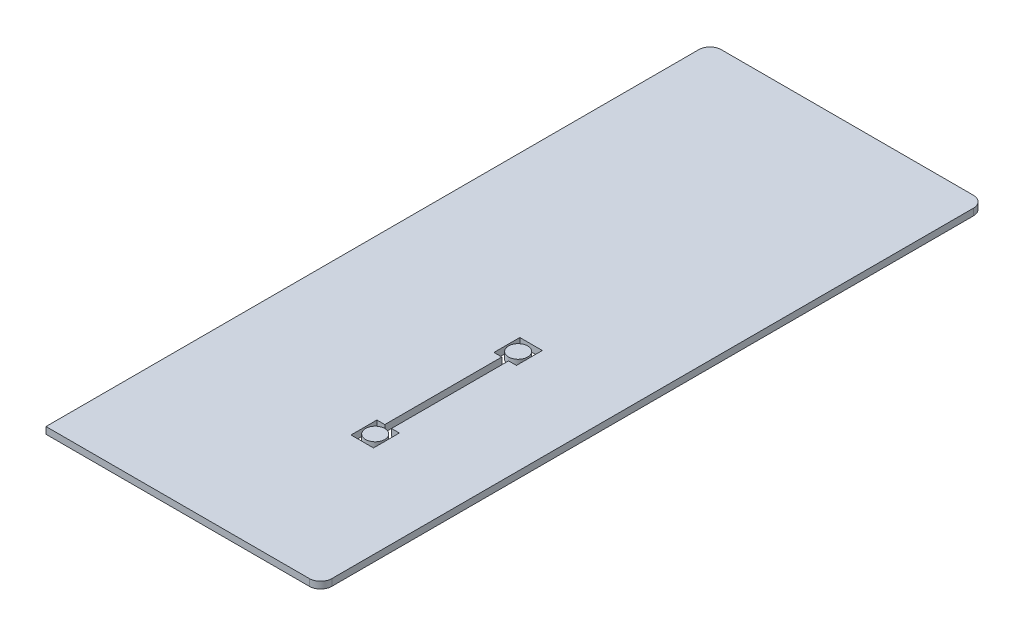
ISO-10303-21;
HEADER;
FILE_DESCRIPTION(('STEP AP214'),'2;1');
FILE_NAME('part.step','',(''),(''),'','','');
FILE_SCHEMA(('AUTOMOTIVE_DESIGN { 1 0 10303 214 1 1 1 1 }'));
ENDSEC;
DATA;
#1=APPLICATION_CONTEXT('core data for automotive mechanical design processes');
#2=APPLICATION_PROTOCOL_DEFINITION('international standard','automotive_design',2000,#1);
#3=PRODUCT_CONTEXT('',#1,'mechanical');
#4=PRODUCT('Part','Part','',(#3));
#5=PRODUCT_RELATED_PRODUCT_CATEGORY('part','',(#4));
#6=PRODUCT_DEFINITION_FORMATION('','',#4);
#7=PRODUCT_DEFINITION_CONTEXT('part definition',#1,'design');
#8=PRODUCT_DEFINITION('design','',#6,#7);
#9=PRODUCT_DEFINITION_SHAPE('','',#8);
#10=(LENGTH_UNIT() NAMED_UNIT(*) SI_UNIT(.MILLI.,.METRE.));
#11=(NAMED_UNIT(*) PLANE_ANGLE_UNIT() SI_UNIT($,.RADIAN.));
#12=(NAMED_UNIT(*) SI_UNIT($,.STERADIAN.) SOLID_ANGLE_UNIT());
#13=UNCERTAINTY_MEASURE_WITH_UNIT(LENGTH_MEASURE(1.E-05),#10,'distance_accuracy_value','');
#14=(GEOMETRIC_REPRESENTATION_CONTEXT(3) GLOBAL_UNCERTAINTY_ASSIGNED_CONTEXT((#13)) GLOBAL_UNIT_ASSIGNED_CONTEXT((#10,
#11,#12)) REPRESENTATION_CONTEXT('',''));
#15=CARTESIAN_POINT('',(0.,0.,0.));
#16=DIRECTION('',(0.,0.,1.));
#17=DIRECTION('',(1.,0.,0.));
#18=AXIS2_PLACEMENT_3D('',#15,#16,#17);
#19=CARTESIAN_POINT('',(0.,3.,0.));
#20=DIRECTION('',(1.,0.,0.));
#21=DIRECTION('',(0.,0.,-1.));
#22=AXIS2_PLACEMENT_3D('',#19,#20,#21);
#23=PLANE('',#22);
#24=DIRECTION('',(0.,0.,1.));
#25=VECTOR('',#24,1.);
#26=CARTESIAN_POINT('',(0.,3.,0.));
#27=LINE('',#26,#25);
#28=CARTESIAN_POINT('',(0.,3.,-290.));
#29=VERTEX_POINT('',#28);
#30=CARTESIAN_POINT('',(0.,3.,0.));
#31=VERTEX_POINT('',#30);
#32=EDGE_CURVE('E275',#29,#31,#27,.T.);
#33=ORIENTED_EDGE('',*,*,#32,.F.);
#34=DIRECTION('',(0.,-1.,0.));
#35=VECTOR('',#34,1.);
#36=CARTESIAN_POINT('',(0.,3.,-290.));
#37=LINE('',#36,#35);
#38=CARTESIAN_POINT('',(0.,0.,-290.));
#39=VERTEX_POINT('',#38);
#40=EDGE_CURVE('E244',#29,#39,#37,.T.);
#41=ORIENTED_EDGE('',*,*,#40,.T.);
#42=DIRECTION('',(0.,0.,1.));
#43=VECTOR('',#42,1.);
#44=CARTESIAN_POINT('',(0.,0.,0.));
#45=LINE('',#44,#43);
#46=CARTESIAN_POINT('',(0.,0.,0.));
#47=VERTEX_POINT('',#46);
#48=EDGE_CURVE('E248',#39,#47,#45,.T.);
#49=ORIENTED_EDGE('',*,*,#48,.T.);
#50=DIRECTION('',(0.,-1.,0.));
#51=VECTOR('',#50,1.);
#52=CARTESIAN_POINT('',(0.,3.,0.));
#53=LINE('',#52,#51);
#54=EDGE_CURVE('E249',#31,#47,#53,.T.);
#55=ORIENTED_EDGE('',*,*,#54,.F.);
#56=EDGE_LOOP('',(#33,#41,#49,#55));
#57=FACE_BOUND('',#56,.T.);
#58=ADVANCED_FACE('F52',(#57),#23,.F.);
#59=CARTESIAN_POINT('',(0.,3.,0.));
#60=DIRECTION('',(0.,0.,-1.));
#61=DIRECTION('',(-1.,0.,0.));
#62=AXIS2_PLACEMENT_3D('',#59,#60,#61);
#63=PLANE('',#62);
#64=DIRECTION('',(1.,0.,0.));
#65=VECTOR('',#64,1.);
#66=CARTESIAN_POINT('',(0.,0.,0.));
#67=LINE('',#66,#65);
#68=CARTESIAN_POINT('',(117.,0.,0.));
#69=VERTEX_POINT('',#68);
#70=EDGE_CURVE('E263',#47,#69,#67,.T.);
#71=ORIENTED_EDGE('',*,*,#70,.T.);
#72=DIRECTION('',(0.,-1.,0.));
#73=VECTOR('',#72,1.);
#74=CARTESIAN_POINT('',(117.,3.,0.));
#75=LINE('',#74,#73);
#76=CARTESIAN_POINT('',(117.,3.,0.));
#77=VERTEX_POINT('',#76);
#78=EDGE_CURVE('E254',#69,#77,#75,.F.);
#79=ORIENTED_EDGE('',*,*,#78,.T.);
#80=DIRECTION('',(1.,0.,0.));
#81=VECTOR('',#80,1.);
#82=CARTESIAN_POINT('',(0.,3.,0.));
#83=LINE('',#82,#81);
#84=EDGE_CURVE('E223',#31,#77,#83,.T.);
#85=ORIENTED_EDGE('',*,*,#84,.F.);
#86=ORIENTED_EDGE('',*,*,#54,.T.);
#87=EDGE_LOOP('',(#71,#79,#85,#86));
#88=FACE_BOUND('',#87,.T.);
#89=ADVANCED_FACE('F425',(#88),#63,.F.);
#90=CARTESIAN_POINT('',(122.,3.,0.));
#91=DIRECTION('',(-1.,0.,0.));
#92=DIRECTION('',(0.,0.,1.));
#93=AXIS2_PLACEMENT_3D('',#90,#91,#92);
#94=PLANE('',#93);
#95=DIRECTION('',(0.,0.,-1.));
#96=VECTOR('',#95,1.);
#97=CARTESIAN_POINT('',(122.,0.,0.));
#98=LINE('',#97,#96);
#99=CARTESIAN_POINT('',(122.,0.,-5.));
#100=VERTEX_POINT('',#99);
#101=CARTESIAN_POINT('',(122.,0.,-290.));
#102=VERTEX_POINT('',#101);
#103=EDGE_CURVE('E253',#100,#102,#98,.T.);
#104=ORIENTED_EDGE('',*,*,#103,.T.);
#105=DIRECTION('',(0.,-1.,0.));
#106=VECTOR('',#105,1.);
#107=CARTESIAN_POINT('',(122.,3.,-290.));
#108=LINE('',#107,#106);
#109=CARTESIAN_POINT('',(122.,3.,-290.));
#110=VERTEX_POINT('',#109);
#111=EDGE_CURVE('E262',#102,#110,#108,.F.);
#112=ORIENTED_EDGE('',*,*,#111,.T.);
#113=DIRECTION('',(0.,0.,-1.));
#114=VECTOR('',#113,1.);
#115=CARTESIAN_POINT('',(122.,3.,0.));
#116=LINE('',#115,#114);
#117=CARTESIAN_POINT('',(122.,3.,-5.));
#118=VERTEX_POINT('',#117);
#119=EDGE_CURVE('E206',#118,#110,#116,.T.);
#120=ORIENTED_EDGE('',*,*,#119,.F.);
#121=DIRECTION('',(0.,-1.,0.));
#122=VECTOR('',#121,1.);
#123=CARTESIAN_POINT('',(122.,3.,-5.));
#124=LINE('',#123,#122);
#125=EDGE_CURVE('E258',#118,#100,#124,.T.);
#126=ORIENTED_EDGE('',*,*,#125,.T.);
#127=EDGE_LOOP('',(#104,#112,#120,#126));
#128=FACE_BOUND('',#127,.T.);
#129=ADVANCED_FACE('F431',(#128),#94,.F.);
#130=CARTESIAN_POINT('',(0.,3.,-295.));
#131=DIRECTION('',(0.,0.,1.));
#132=DIRECTION('',(1.,0.,0.));
#133=AXIS2_PLACEMENT_3D('',#130,#131,#132);
#134=PLANE('',#133);
#135=DIRECTION('',(-1.,0.,0.));
#136=VECTOR('',#135,1.);
#137=CARTESIAN_POINT('',(0.,0.,-295.));
#138=LINE('',#137,#136);
#139=CARTESIAN_POINT('',(117.,0.,-295.));
#140=VERTEX_POINT('',#139);
#141=CARTESIAN_POINT('',(5.,0.,-295.));
#142=VERTEX_POINT('',#141);
#143=EDGE_CURVE('E229',#140,#142,#138,.T.);
#144=ORIENTED_EDGE('',*,*,#143,.T.);
#145=DIRECTION('',(0.,-1.,0.));
#146=VECTOR('',#145,1.);
#147=CARTESIAN_POINT('',(5.,3.,-295.));
#148=LINE('',#147,#146);
#149=CARTESIAN_POINT('',(5.,3.,-295.));
#150=VERTEX_POINT('',#149);
#151=EDGE_CURVE('E224',#142,#150,#148,.F.);
#152=ORIENTED_EDGE('',*,*,#151,.T.);
#153=DIRECTION('',(-1.,0.,0.));
#154=VECTOR('',#153,1.);
#155=CARTESIAN_POINT('',(0.,3.,-295.));
#156=LINE('',#155,#154);
#157=CARTESIAN_POINT('',(117.,3.,-295.));
#158=VERTEX_POINT('',#157);
#159=EDGE_CURVE('E233',#158,#150,#156,.T.);
#160=ORIENTED_EDGE('',*,*,#159,.F.);
#161=DIRECTION('',(0.,-1.,0.));
#162=VECTOR('',#161,1.);
#163=CARTESIAN_POINT('',(117.,3.,-295.));
#164=LINE('',#163,#162);
#165=EDGE_CURVE('E228',#158,#140,#164,.T.);
#166=ORIENTED_EDGE('',*,*,#165,.T.);
#167=EDGE_LOOP('',(#144,#152,#160,#166));
#168=FACE_BOUND('',#167,.T.);
#169=ADVANCED_FACE('F441',(#168),#134,.F.);
#170=CARTESIAN_POINT('',(0.,3.,0.));
#171=DIRECTION('',(0.,-1.,0.));
#172=DIRECTION('',(0.,0.,-1.));
#173=AXIS2_PLACEMENT_3D('',#170,#171,#172);
#174=PLANE('',#173);
#175=DIRECTION('',(1.,0.,0.));
#176=VECTOR('',#175,1.);
#177=CARTESIAN_POINT('',(74.5,3.,-128.));
#178=LINE('',#177,#176);
#179=CARTESIAN_POINT('',(71.,3.,-128.));
#180=VERTEX_POINT('',#179);
#181=CARTESIAN_POINT('',(74.5,3.,-128.));
#182=VERTEX_POINT('',#181);
#183=EDGE_CURVE('E63',#180,#182,#178,.T.);
#184=ORIENTED_EDGE('',*,*,#183,.F.);
#185=DIRECTION('',(0.,0.,1.));
#186=VECTOR('',#185,1.);
#187=CARTESIAN_POINT('',(71.,3.,-128.));
#188=LINE('',#187,#186);
#189=CARTESIAN_POINT('',(71.,3.,-139.5));
#190=VERTEX_POINT('',#189);
#191=EDGE_CURVE('E152',#190,#180,#188,.T.);
#192=ORIENTED_EDGE('',*,*,#191,.F.);
#193=DIRECTION('',(-1.,0.,0.));
#194=VECTOR('',#193,1.);
#195=CARTESIAN_POINT('',(71.,3.,-139.5));
#196=LINE('',#195,#194);
#197=CARTESIAN_POINT('',(81.,3.,-139.5));
#198=VERTEX_POINT('',#197);
#199=EDGE_CURVE('E315',#198,#190,#196,.T.);
#200=ORIENTED_EDGE('',*,*,#199,.F.);
#201=DIRECTION('',(0.,0.,-1.));
#202=VECTOR('',#201,1.);
#203=CARTESIAN_POINT('',(81.,3.,-139.5));
#204=LINE('',#203,#202);
#205=CARTESIAN_POINT('',(81.,3.,-128.));
#206=VERTEX_POINT('',#205);
#207=EDGE_CURVE('E310',#206,#198,#204,.T.);
#208=ORIENTED_EDGE('',*,*,#207,.F.);
#209=DIRECTION('',(1.,0.,0.));
#210=VECTOR('',#209,1.);
#211=CARTESIAN_POINT('',(81.,3.,-128.));
#212=LINE('',#211,#210);
#213=CARTESIAN_POINT('',(77.5,3.,-128.));
#214=VERTEX_POINT('',#213);
#215=EDGE_CURVE('E305',#214,#206,#212,.T.);
#216=ORIENTED_EDGE('',*,*,#215,.F.);
#217=DIRECTION('',(0.,0.,-1.));
#218=VECTOR('',#217,1.);
#219=CARTESIAN_POINT('',(77.5,3.,-128.));
#220=LINE('',#219,#218);
#221=CARTESIAN_POINT('',(77.5,3.,-76.));
#222=VERTEX_POINT('',#221);
#223=EDGE_CURVE('E300',#222,#214,#220,.T.);
#224=ORIENTED_EDGE('',*,*,#223,.F.);
#225=DIRECTION('',(-1.,0.,0.));
#226=VECTOR('',#225,1.);
#227=CARTESIAN_POINT('',(77.5,3.,-76.));
#228=LINE('',#227,#226);
#229=CARTESIAN_POINT('',(81.,3.,-76.));
#230=VERTEX_POINT('',#229);
#231=EDGE_CURVE('E295',#230,#222,#228,.T.);
#232=ORIENTED_EDGE('',*,*,#231,.F.);
#233=DIRECTION('',(0.,0.,-1.));
#234=VECTOR('',#233,1.);
#235=CARTESIAN_POINT('',(81.,3.,-76.));
#236=LINE('',#235,#234);
#237=CARTESIAN_POINT('',(81.,3.,-64.5));
#238=VERTEX_POINT('',#237);
#239=EDGE_CURVE('E290',#238,#230,#236,.T.);
#240=ORIENTED_EDGE('',*,*,#239,.F.);
#241=DIRECTION('',(1.,0.,0.));
#242=VECTOR('',#241,1.);
#243=CARTESIAN_POINT('',(81.,3.,-64.5));
#244=LINE('',#243,#242);
#245=CARTESIAN_POINT('',(71.,3.,-64.5));
#246=VERTEX_POINT('',#245);
#247=EDGE_CURVE('E285',#246,#238,#244,.T.);
#248=ORIENTED_EDGE('',*,*,#247,.F.);
#249=DIRECTION('',(0.,0.,1.));
#250=VECTOR('',#249,1.);
#251=CARTESIAN_POINT('',(71.,3.,-64.5));
#252=LINE('',#251,#250);
#253=CARTESIAN_POINT('',(71.,3.,-76.));
#254=VERTEX_POINT('',#253);
#255=EDGE_CURVE('E140',#254,#246,#252,.T.);
#256=ORIENTED_EDGE('',*,*,#255,.F.);
#257=DIRECTION('',(-1.,0.,0.));
#258=VECTOR('',#257,1.);
#259=CARTESIAN_POINT('',(71.,3.,-76.));
#260=LINE('',#259,#258);
#261=CARTESIAN_POINT('',(74.5,3.,-76.));
#262=VERTEX_POINT('',#261);
#263=EDGE_CURVE('E123',#262,#254,#260,.T.);
#264=ORIENTED_EDGE('',*,*,#263,.F.);
#265=DIRECTION('',(0.,0.,1.));
#266=VECTOR('',#265,1.);
#267=CARTESIAN_POINT('',(74.5,3.,-76.));
#268=LINE('',#267,#266);
#269=EDGE_CURVE('E129',#182,#262,#268,.T.);
#270=ORIENTED_EDGE('',*,*,#269,.F.);
#271=EDGE_LOOP('',(#184,#192,#200,#208,#216,#224,#232,#240,#248,#256,#264,#270));
#272=FACE_BOUND('',#271,.T.);
#273=ORIENTED_EDGE('',*,*,#159,.T.);
#274=CARTESIAN_POINT('',(5.,3.,-290.));
#275=DIRECTION('',(0.,-1.,0.));
#276=DIRECTION('',(0.,0.,-1.));
#277=AXIS2_PLACEMENT_3D('',#274,#275,#276);
#278=CIRCLE('',#277,5.);
#279=EDGE_CURVE('E218',#150,#29,#278,.F.);
#280=ORIENTED_EDGE('',*,*,#279,.T.);
#281=ORIENTED_EDGE('',*,*,#32,.T.);
#282=ORIENTED_EDGE('',*,*,#84,.T.);
#283=CARTESIAN_POINT('',(117.,3.,-5.));
#284=DIRECTION('',(0.,-1.,0.));
#285=DIRECTION('',(0.,0.,-1.));
#286=AXIS2_PLACEMENT_3D('',#283,#284,#285);
#287=CIRCLE('',#286,5.);
#288=EDGE_CURVE('E214',#77,#118,#287,.F.);
#289=ORIENTED_EDGE('',*,*,#288,.T.);
#290=ORIENTED_EDGE('',*,*,#119,.T.);
#291=CARTESIAN_POINT('',(117.,3.,-290.));
#292=DIRECTION('',(0.,-1.,0.));
#293=DIRECTION('',(0.,0.,-1.));
#294=AXIS2_PLACEMENT_3D('',#291,#292,#293);
#295=CIRCLE('',#294,5.);
#296=EDGE_CURVE('E202',#110,#158,#295,.F.);
#297=ORIENTED_EDGE('',*,*,#296,.T.);
#298=EDGE_LOOP('',(#273,#280,#281,#282,#289,#290,#297));
#299=FACE_BOUND('',#298,.T.);
#300=ADVANCED_FACE('F54',(#272,#299),#174,.F.);
#301=CARTESIAN_POINT('',(0.,0.,0.));
#302=DIRECTION('',(0.,-1.,0.));
#303=DIRECTION('',(0.,0.,-1.));
#304=AXIS2_PLACEMENT_3D('',#301,#302,#303);
#305=PLANE('',#304);
#306=DIRECTION('',(0.,0.,1.));
#307=VECTOR('',#306,1.);
#308=CARTESIAN_POINT('',(71.,0.,-128.));
#309=LINE('',#308,#307);
#310=CARTESIAN_POINT('',(71.,0.,-139.5));
#311=VERTEX_POINT('',#310);
#312=CARTESIAN_POINT('',(71.,0.,-128.));
#313=VERTEX_POINT('',#312);
#314=EDGE_CURVE('E56',#311,#313,#309,.T.);
#315=ORIENTED_EDGE('',*,*,#314,.T.);
#316=DIRECTION('',(1.,0.,0.));
#317=VECTOR('',#316,1.);
#318=CARTESIAN_POINT('',(74.5,0.,-128.));
#319=LINE('',#318,#317);
#320=CARTESIAN_POINT('',(74.5,0.,-128.));
#321=VERTEX_POINT('',#320);
#322=EDGE_CURVE('E195',#313,#321,#319,.T.);
#323=ORIENTED_EDGE('',*,*,#322,.T.);
#324=DIRECTION('',(0.,0.,1.));
#325=VECTOR('',#324,1.);
#326=CARTESIAN_POINT('',(74.5,0.,-76.));
#327=LINE('',#326,#325);
#328=CARTESIAN_POINT('',(74.5,0.,-76.));
#329=VERTEX_POINT('',#328);
#330=EDGE_CURVE('E193',#321,#329,#327,.T.);
#331=ORIENTED_EDGE('',*,*,#330,.T.);
#332=DIRECTION('',(-1.,0.,0.));
#333=VECTOR('',#332,1.);
#334=CARTESIAN_POINT('',(71.,0.,-76.));
#335=LINE('',#334,#333);
#336=CARTESIAN_POINT('',(71.,0.,-76.));
#337=VERTEX_POINT('',#336);
#338=EDGE_CURVE('E126',#329,#337,#335,.T.);
#339=ORIENTED_EDGE('',*,*,#338,.T.);
#340=DIRECTION('',(0.,0.,1.));
#341=VECTOR('',#340,1.);
#342=CARTESIAN_POINT('',(71.,0.,-64.5));
#343=LINE('',#342,#341);
#344=CARTESIAN_POINT('',(71.,0.,-64.5));
#345=VERTEX_POINT('',#344);
#346=EDGE_CURVE('E187',#337,#345,#343,.T.);
#347=ORIENTED_EDGE('',*,*,#346,.T.);
#348=DIRECTION('',(1.,0.,0.));
#349=VECTOR('',#348,1.);
#350=CARTESIAN_POINT('',(81.,0.,-64.5));
#351=LINE('',#350,#349);
#352=CARTESIAN_POINT('',(81.,0.,-64.5));
#353=VERTEX_POINT('',#352);
#354=EDGE_CURVE('E183',#345,#353,#351,.T.);
#355=ORIENTED_EDGE('',*,*,#354,.T.);
#356=DIRECTION('',(0.,0.,-1.));
#357=VECTOR('',#356,1.);
#358=CARTESIAN_POINT('',(81.,0.,-76.));
#359=LINE('',#358,#357);
#360=CARTESIAN_POINT('',(81.,0.,-76.));
#361=VERTEX_POINT('',#360);
#362=EDGE_CURVE('E179',#353,#361,#359,.T.);
#363=ORIENTED_EDGE('',*,*,#362,.T.);
#364=DIRECTION('',(-1.,0.,0.));
#365=VECTOR('',#364,1.);
#366=CARTESIAN_POINT('',(77.5,0.,-76.));
#367=LINE('',#366,#365);
#368=CARTESIAN_POINT('',(77.5,0.,-76.));
#369=VERTEX_POINT('',#368);
#370=EDGE_CURVE('E175',#361,#369,#367,.T.);
#371=ORIENTED_EDGE('',*,*,#370,.T.);
#372=DIRECTION('',(0.,0.,-1.));
#373=VECTOR('',#372,1.);
#374=CARTESIAN_POINT('',(77.5,0.,-128.));
#375=LINE('',#374,#373);
#376=CARTESIAN_POINT('',(77.5,0.,-128.));
#377=VERTEX_POINT('',#376);
#378=EDGE_CURVE('E171',#369,#377,#375,.T.);
#379=ORIENTED_EDGE('',*,*,#378,.T.);
#380=DIRECTION('',(1.,0.,0.));
#381=VECTOR('',#380,1.);
#382=CARTESIAN_POINT('',(81.,0.,-128.));
#383=LINE('',#382,#381);
#384=CARTESIAN_POINT('',(81.,0.,-128.));
#385=VERTEX_POINT('',#384);
#386=EDGE_CURVE('E167',#377,#385,#383,.T.);
#387=ORIENTED_EDGE('',*,*,#386,.T.);
#388=DIRECTION('',(0.,0.,-1.));
#389=VECTOR('',#388,1.);
#390=CARTESIAN_POINT('',(81.,0.,-139.5));
#391=LINE('',#390,#389);
#392=CARTESIAN_POINT('',(81.,0.,-139.5));
#393=VERTEX_POINT('',#392);
#394=EDGE_CURVE('E163',#385,#393,#391,.T.);
#395=ORIENTED_EDGE('',*,*,#394,.T.);
#396=DIRECTION('',(-1.,0.,0.));
#397=VECTOR('',#396,1.);
#398=CARTESIAN_POINT('',(71.,0.,-139.5));
#399=LINE('',#398,#397);
#400=EDGE_CURVE('E158',#393,#311,#399,.T.);
#401=ORIENTED_EDGE('',*,*,#400,.T.);
#402=EDGE_LOOP('',(#315,#323,#331,#339,#347,#355,#363,#371,#379,#387,#395,#401));
#403=FACE_BOUND('',#402,.T.);
#404=ORIENTED_EDGE('',*,*,#48,.F.);
#405=CARTESIAN_POINT('',(5.,0.,-290.));
#406=DIRECTION('',(0.,-1.,0.));
#407=DIRECTION('',(0.,0.,-1.));
#408=AXIS2_PLACEMENT_3D('',#405,#406,#407);
#409=CIRCLE('',#408,5.);
#410=EDGE_CURVE('E162',#39,#142,#409,.T.);
#411=ORIENTED_EDGE('',*,*,#410,.T.);
#412=ORIENTED_EDGE('',*,*,#143,.F.);
#413=CARTESIAN_POINT('',(117.,0.,-290.));
#414=DIRECTION('',(0.,-1.,0.));
#415=DIRECTION('',(0.,0.,-1.));
#416=AXIS2_PLACEMENT_3D('',#413,#414,#415);
#417=CIRCLE('',#416,5.);
#418=EDGE_CURVE('E237',#140,#102,#417,.T.);
#419=ORIENTED_EDGE('',*,*,#418,.T.);
#420=ORIENTED_EDGE('',*,*,#103,.F.);
#421=CARTESIAN_POINT('',(117.,0.,-5.));
#422=DIRECTION('',(0.,-1.,0.));
#423=DIRECTION('',(0.,0.,-1.));
#424=AXIS2_PLACEMENT_3D('',#421,#422,#423);
#425=CIRCLE('',#424,5.);
#426=EDGE_CURVE('E157',#100,#69,#425,.T.);
#427=ORIENTED_EDGE('',*,*,#426,.T.);
#428=ORIENTED_EDGE('',*,*,#70,.F.);
#429=EDGE_LOOP('',(#404,#411,#412,#419,#420,#427,#428));
#430=FACE_BOUND('',#429,.T.);
#431=ADVANCED_FACE('F357',(#403,#430),#305,.T.);
#432=CARTESIAN_POINT('',(5.,3.,-290.));
#433=DIRECTION('',(0.,-1.,0.));
#434=DIRECTION('',(0.,0.,-1.));
#435=AXIS2_PLACEMENT_3D('',#432,#433,#434);
#436=CYLINDRICAL_SURFACE('',#435,5.);
#437=ORIENTED_EDGE('',*,*,#279,.F.);
#438=ORIENTED_EDGE('',*,*,#151,.F.);
#439=ORIENTED_EDGE('',*,*,#410,.F.);
#440=ORIENTED_EDGE('',*,*,#40,.F.);
#441=EDGE_LOOP('',(#437,#438,#439,#440));
#442=FACE_BOUND('',#441,.T.);
#443=ADVANCED_FACE('F436',(#442),#436,.T.);
#444=CARTESIAN_POINT('',(117.,3.,-290.));
#445=DIRECTION('',(0.,-1.,0.));
#446=DIRECTION('',(0.,0.,-1.));
#447=AXIS2_PLACEMENT_3D('',#444,#445,#446);
#448=CYLINDRICAL_SURFACE('',#447,5.);
#449=ORIENTED_EDGE('',*,*,#296,.F.);
#450=ORIENTED_EDGE('',*,*,#111,.F.);
#451=ORIENTED_EDGE('',*,*,#418,.F.);
#452=ORIENTED_EDGE('',*,*,#165,.F.);
#453=EDGE_LOOP('',(#449,#450,#451,#452));
#454=FACE_BOUND('',#453,.T.);
#455=ADVANCED_FACE('F563',(#454),#448,.T.);
#456=CARTESIAN_POINT('',(117.,3.,-5.));
#457=DIRECTION('',(0.,-1.,0.));
#458=DIRECTION('',(0.,0.,-1.));
#459=AXIS2_PLACEMENT_3D('',#456,#457,#458);
#460=CYLINDRICAL_SURFACE('',#459,5.);
#461=ORIENTED_EDGE('',*,*,#288,.F.);
#462=ORIENTED_EDGE('',*,*,#78,.F.);
#463=ORIENTED_EDGE('',*,*,#426,.F.);
#464=ORIENTED_EDGE('',*,*,#125,.F.);
#465=EDGE_LOOP('',(#461,#462,#463,#464));
#466=FACE_BOUND('',#465,.T.);
#467=ADVANCED_FACE('F450',(#466),#460,.T.);
#468=CARTESIAN_POINT('',(71.,0.,-128.));
#469=DIRECTION('',(-1.,0.,0.));
#470=DIRECTION('',(0.,0.,1.));
#471=AXIS2_PLACEMENT_3D('',#468,#469,#470);
#472=PLANE('',#471);
#473=ORIENTED_EDGE('',*,*,#191,.T.);
#474=DIRECTION('',(0.,1.,0.));
#475=VECTOR('',#474,1.);
#476=CARTESIAN_POINT('',(71.,0.,-128.));
#477=LINE('',#476,#475);
#478=EDGE_CURVE('E12',#313,#180,#477,.T.);
#479=ORIENTED_EDGE('',*,*,#478,.F.);
#480=ORIENTED_EDGE('',*,*,#314,.F.);
#481=DIRECTION('',(0.,1.,0.));
#482=VECTOR('',#481,1.);
#483=CARTESIAN_POINT('',(71.,0.,-139.5));
#484=LINE('',#483,#482);
#485=EDGE_CURVE('E156',#311,#190,#484,.T.);
#486=ORIENTED_EDGE('',*,*,#485,.T.);
#487=EDGE_LOOP('',(#473,#479,#480,#486));
#488=FACE_BOUND('',#487,.T.);
#489=ADVANCED_FACE('F446',(#488),#472,.F.);
#490=CARTESIAN_POINT('',(71.,0.,-139.5));
#491=DIRECTION('',(0.,0.,-1.));
#492=DIRECTION('',(-1.,0.,0.));
#493=AXIS2_PLACEMENT_3D('',#490,#491,#492);
#494=PLANE('',#493);
#495=ORIENTED_EDGE('',*,*,#199,.T.);
#496=ORIENTED_EDGE('',*,*,#485,.F.);
#497=ORIENTED_EDGE('',*,*,#400,.F.);
#498=DIRECTION('',(0.,1.,0.));
#499=VECTOR('',#498,1.);
#500=CARTESIAN_POINT('',(81.,0.,-139.5));
#501=LINE('',#500,#499);
#502=EDGE_CURVE('E311',#393,#198,#501,.T.);
#503=ORIENTED_EDGE('',*,*,#502,.T.);
#504=EDGE_LOOP('',(#495,#496,#497,#503));
#505=FACE_BOUND('',#504,.T.);
#506=ADVANCED_FACE('F449',(#505),#494,.F.);
#507=CARTESIAN_POINT('',(81.,0.,-139.5));
#508=DIRECTION('',(1.,0.,0.));
#509=DIRECTION('',(0.,0.,-1.));
#510=AXIS2_PLACEMENT_3D('',#507,#508,#509);
#511=PLANE('',#510);
#512=ORIENTED_EDGE('',*,*,#207,.T.);
#513=ORIENTED_EDGE('',*,*,#502,.F.);
#514=ORIENTED_EDGE('',*,*,#394,.F.);
#515=DIRECTION('',(0.,1.,0.));
#516=VECTOR('',#515,1.);
#517=CARTESIAN_POINT('',(81.,0.,-128.));
#518=LINE('',#517,#516);
#519=EDGE_CURVE('E306',#385,#206,#518,.T.);
#520=ORIENTED_EDGE('',*,*,#519,.T.);
#521=EDGE_LOOP('',(#512,#513,#514,#520));
#522=FACE_BOUND('',#521,.T.);
#523=ADVANCED_FACE('F412',(#522),#511,.F.);
#524=CARTESIAN_POINT('',(81.,0.,-128.));
#525=DIRECTION('',(0.,0.,1.));
#526=DIRECTION('',(1.,0.,0.));
#527=AXIS2_PLACEMENT_3D('',#524,#525,#526);
#528=PLANE('',#527);
#529=ORIENTED_EDGE('',*,*,#215,.T.);
#530=ORIENTED_EDGE('',*,*,#519,.F.);
#531=ORIENTED_EDGE('',*,*,#386,.F.);
#532=DIRECTION('',(0.,1.,0.));
#533=VECTOR('',#532,1.);
#534=CARTESIAN_POINT('',(77.5,0.,-128.));
#535=LINE('',#534,#533);
#536=EDGE_CURVE('E301',#377,#214,#535,.T.);
#537=ORIENTED_EDGE('',*,*,#536,.T.);
#538=EDGE_LOOP('',(#529,#530,#531,#537));
#539=FACE_BOUND('',#538,.T.);
#540=ADVANCED_FACE('F405',(#539),#528,.F.);
#541=CARTESIAN_POINT('',(77.5,0.,-128.));
#542=DIRECTION('',(1.,0.,0.));
#543=DIRECTION('',(0.,0.,-1.));
#544=AXIS2_PLACEMENT_3D('',#541,#542,#543);
#545=PLANE('',#544);
#546=ORIENTED_EDGE('',*,*,#223,.T.);
#547=ORIENTED_EDGE('',*,*,#536,.F.);
#548=ORIENTED_EDGE('',*,*,#378,.F.);
#549=DIRECTION('',(0.,1.,0.));
#550=VECTOR('',#549,1.);
#551=CARTESIAN_POINT('',(77.5,0.,-76.));
#552=LINE('',#551,#550);
#553=EDGE_CURVE('E296',#369,#222,#552,.T.);
#554=ORIENTED_EDGE('',*,*,#553,.T.);
#555=EDGE_LOOP('',(#546,#547,#548,#554));
#556=FACE_BOUND('',#555,.T.);
#557=ADVANCED_FACE('F410',(#556),#545,.F.);
#558=CARTESIAN_POINT('',(77.5,0.,-76.));
#559=DIRECTION('',(0.,0.,-1.));
#560=DIRECTION('',(-1.,0.,0.));
#561=AXIS2_PLACEMENT_3D('',#558,#559,#560);
#562=PLANE('',#561);
#563=ORIENTED_EDGE('',*,*,#231,.T.);
#564=ORIENTED_EDGE('',*,*,#553,.F.);
#565=ORIENTED_EDGE('',*,*,#370,.F.);
#566=DIRECTION('',(0.,1.,0.));
#567=VECTOR('',#566,1.);
#568=CARTESIAN_POINT('',(81.,0.,-76.));
#569=LINE('',#568,#567);
#570=EDGE_CURVE('E291',#361,#230,#569,.T.);
#571=ORIENTED_EDGE('',*,*,#570,.T.);
#572=EDGE_LOOP('',(#563,#564,#565,#571));
#573=FACE_BOUND('',#572,.T.);
#574=ADVANCED_FACE('F415',(#573),#562,.F.);
#575=CARTESIAN_POINT('',(81.,0.,-76.));
#576=DIRECTION('',(1.,0.,0.));
#577=DIRECTION('',(0.,0.,-1.));
#578=AXIS2_PLACEMENT_3D('',#575,#576,#577);
#579=PLANE('',#578);
#580=ORIENTED_EDGE('',*,*,#239,.T.);
#581=ORIENTED_EDGE('',*,*,#570,.F.);
#582=ORIENTED_EDGE('',*,*,#362,.F.);
#583=DIRECTION('',(0.,1.,0.));
#584=VECTOR('',#583,1.);
#585=CARTESIAN_POINT('',(81.,0.,-64.5));
#586=LINE('',#585,#584);
#587=EDGE_CURVE('E286',#353,#238,#586,.T.);
#588=ORIENTED_EDGE('',*,*,#587,.T.);
#589=EDGE_LOOP('',(#580,#581,#582,#588));
#590=FACE_BOUND('',#589,.T.);
#591=ADVANCED_FACE('F347',(#590),#579,.F.);
#592=CARTESIAN_POINT('',(81.,0.,-64.5));
#593=DIRECTION('',(0.,0.,1.));
#594=DIRECTION('',(1.,0.,0.));
#595=AXIS2_PLACEMENT_3D('',#592,#593,#594);
#596=PLANE('',#595);
#597=ORIENTED_EDGE('',*,*,#247,.T.);
#598=ORIENTED_EDGE('',*,*,#587,.F.);
#599=ORIENTED_EDGE('',*,*,#354,.F.);
#600=DIRECTION('',(0.,1.,0.));
#601=VECTOR('',#600,1.);
#602=CARTESIAN_POINT('',(71.,0.,-64.5));
#603=LINE('',#602,#601);
#604=EDGE_CURVE('E281',#345,#246,#603,.T.);
#605=ORIENTED_EDGE('',*,*,#604,.T.);
#606=EDGE_LOOP('',(#597,#598,#599,#605));
#607=FACE_BOUND('',#606,.T.);
#608=ADVANCED_FACE('F340',(#607),#596,.F.);
#609=CARTESIAN_POINT('',(71.,0.,-64.5));
#610=DIRECTION('',(-1.,0.,0.));
#611=DIRECTION('',(0.,0.,1.));
#612=AXIS2_PLACEMENT_3D('',#609,#610,#611);
#613=PLANE('',#612);
#614=ORIENTED_EDGE('',*,*,#255,.T.);
#615=ORIENTED_EDGE('',*,*,#604,.F.);
#616=ORIENTED_EDGE('',*,*,#346,.F.);
#617=DIRECTION('',(0.,1.,0.));
#618=VECTOR('',#617,1.);
#619=CARTESIAN_POINT('',(71.,0.,-76.));
#620=LINE('',#619,#618);
#621=EDGE_CURVE('E142',#337,#254,#620,.T.);
#622=ORIENTED_EDGE('',*,*,#621,.T.);
#623=EDGE_LOOP('',(#614,#615,#616,#622));
#624=FACE_BOUND('',#623,.T.);
#625=ADVANCED_FACE('F356',(#624),#613,.F.);
#626=CARTESIAN_POINT('',(71.,0.,-76.));
#627=DIRECTION('',(0.,0.,-1.));
#628=DIRECTION('',(-1.,0.,0.));
#629=AXIS2_PLACEMENT_3D('',#626,#627,#628);
#630=PLANE('',#629);
#631=ORIENTED_EDGE('',*,*,#263,.T.);
#632=ORIENTED_EDGE('',*,*,#621,.F.);
#633=ORIENTED_EDGE('',*,*,#338,.F.);
#634=DIRECTION('',(0.,1.,0.));
#635=VECTOR('',#634,1.);
#636=CARTESIAN_POINT('',(74.5,0.,-76.));
#637=LINE('',#636,#635);
#638=EDGE_CURVE('E117',#329,#262,#637,.T.);
#639=ORIENTED_EDGE('',*,*,#638,.T.);
#640=EDGE_LOOP('',(#631,#632,#633,#639));
#641=FACE_BOUND('',#640,.T.);
#642=ADVANCED_FACE('F121',(#641),#630,.F.);
#643=CARTESIAN_POINT('',(74.5,0.,-76.));
#644=DIRECTION('',(-1.,0.,0.));
#645=DIRECTION('',(0.,0.,1.));
#646=AXIS2_PLACEMENT_3D('',#643,#644,#645);
#647=PLANE('',#646);
#648=ORIENTED_EDGE('',*,*,#269,.T.);
#649=ORIENTED_EDGE('',*,*,#638,.F.);
#650=ORIENTED_EDGE('',*,*,#330,.F.);
#651=DIRECTION('',(0.,1.,0.));
#652=VECTOR('',#651,1.);
#653=CARTESIAN_POINT('',(74.5,0.,-128.));
#654=LINE('',#653,#652);
#655=EDGE_CURVE('E72',#321,#182,#654,.T.);
#656=ORIENTED_EDGE('',*,*,#655,.T.);
#657=EDGE_LOOP('',(#648,#649,#650,#656));
#658=FACE_BOUND('',#657,.T.);
#659=ADVANCED_FACE('F132',(#658),#647,.F.);
#660=CARTESIAN_POINT('',(74.5,0.,-128.));
#661=DIRECTION('',(0.,0.,1.));
#662=DIRECTION('',(1.,0.,0.));
#663=AXIS2_PLACEMENT_3D('',#660,#661,#662);
#664=PLANE('',#663);
#665=ORIENTED_EDGE('',*,*,#183,.T.);
#666=ORIENTED_EDGE('',*,*,#655,.F.);
#667=ORIENTED_EDGE('',*,*,#322,.F.);
#668=ORIENTED_EDGE('',*,*,#478,.T.);
#669=EDGE_LOOP('',(#665,#666,#667,#668));
#670=FACE_BOUND('',#669,.T.);
#671=ADVANCED_FACE('F360',(#670),#664,.F.);
#672=CLOSED_SHELL('',(#58,#89,#129,#169,#300,#431,#443,#455,#467,#489,#506,#523,#540,#557,#574,
#591,#608,#625,#642,#659,#671));
#673=MANIFOLD_SOLID_BREP('B2',#672);
#674=CARTESIAN_POINT('',(0.,0.,0.));
#675=DIRECTION('',(0.,-1.,0.));
#676=DIRECTION('',(0.,0.,-1.));
#677=AXIS2_PLACEMENT_3D('',#674,#675,#676);
#678=PLANE('',#677);
#679=CARTESIAN_POINT('',(76.,0.,-70.25));
#680=DIRECTION('',(0.,1.,0.));
#681=DIRECTION('',(0.,0.,1.));
#682=AXIS2_PLACEMENT_3D('',#679,#680,#681);
#683=CIRCLE('',#682,4.25000000000001);
#684=CARTESIAN_POINT('',(76.,0.,-66.));
#685=VERTEX_POINT('',#684);
#686=EDGE_CURVE('E677',#685,#685,#683,.T.);
#687=ORIENTED_EDGE('',*,*,#686,.F.);
#688=EDGE_LOOP('',(#687));
#689=FACE_BOUND('',#688,.T.);
#690=ADVANCED_FACE('F673',(#689),#678,.T.);
#691=CARTESIAN_POINT('',(76.,0.,-70.25));
#692=DIRECTION('',(0.,1.,0.));
#693=DIRECTION('',(0.,0.,1.));
#694=AXIS2_PLACEMENT_3D('',#691,#692,#693);
#695=CYLINDRICAL_SURFACE('',#694,4.25000000000001);
#696=ORIENTED_EDGE('',*,*,#686,.T.);
#697=EDGE_LOOP('',(#696));
#698=FACE_BOUND('',#697,.T.);
#699=CARTESIAN_POINT('',(76.,3.,-70.25));
#700=DIRECTION('',(0.,1.,0.));
#701=DIRECTION('',(0.,0.,1.));
#702=AXIS2_PLACEMENT_3D('',#699,#700,#701);
#703=CIRCLE('',#702,4.25000000000001);
#704=CARTESIAN_POINT('',(76.,3.,-66.));
#705=VERTEX_POINT('',#704);
#706=EDGE_CURVE('E51',#705,#705,#703,.T.);
#707=ORIENTED_EDGE('',*,*,#706,.F.);
#708=EDGE_LOOP('',(#707));
#709=FACE_BOUND('',#708,.T.);
#710=ADVANCED_FACE('F686',(#698,#709),#695,.T.);
#711=CARTESIAN_POINT('',(0.,3.,0.));
#712=DIRECTION('',(0.,-1.,0.));
#713=DIRECTION('',(0.,0.,-1.));
#714=AXIS2_PLACEMENT_3D('',#711,#712,#713);
#715=PLANE('',#714);
#716=ORIENTED_EDGE('',*,*,#706,.T.);
#717=EDGE_LOOP('',(#716));
#718=FACE_BOUND('',#717,.T.);
#719=ADVANCED_FACE('F675',(#718),#715,.F.);
#720=CLOSED_SHELL('',(#690,#710,#719));
#721=MANIFOLD_SOLID_BREP('B6',#720);
#722=CARTESIAN_POINT('',(0.,0.,0.));
#723=DIRECTION('',(0.,-1.,0.));
#724=DIRECTION('',(0.,0.,-1.));
#725=AXIS2_PLACEMENT_3D('',#722,#723,#724);
#726=PLANE('',#725);
#727=CARTESIAN_POINT('',(76.,0.,-133.75));
#728=DIRECTION('',(0.,1.,0.));
#729=DIRECTION('',(0.,0.,1.));
#730=AXIS2_PLACEMENT_3D('',#727,#728,#729);
#731=CIRCLE('',#730,4.24999999999999);
#732=CARTESIAN_POINT('',(76.,0.,-129.5));
#733=VERTEX_POINT('',#732);
#734=EDGE_CURVE('E672',#733,#733,#731,.T.);
#735=ORIENTED_EDGE('',*,*,#734,.F.);
#736=EDGE_LOOP('',(#735));
#737=FACE_BOUND('',#736,.T.);
#738=ADVANCED_FACE('F719',(#737),#726,.T.);
#739=CARTESIAN_POINT('',(76.,0.,-133.75));
#740=DIRECTION('',(0.,1.,0.));
#741=DIRECTION('',(0.,0.,1.));
#742=AXIS2_PLACEMENT_3D('',#739,#740,#741);
#743=CYLINDRICAL_SURFACE('',#742,4.24999999999999);
#744=ORIENTED_EDGE('',*,*,#734,.T.);
#745=EDGE_LOOP('',(#744));
#746=FACE_BOUND('',#745,.T.);
#747=CARTESIAN_POINT('',(76.,3.,-133.75));
#748=DIRECTION('',(0.,1.,0.));
#749=DIRECTION('',(0.,0.,1.));
#750=AXIS2_PLACEMENT_3D('',#747,#748,#749);
#751=CIRCLE('',#750,4.24999999999999);
#752=CARTESIAN_POINT('',(76.,3.,-129.5));
#753=VERTEX_POINT('',#752);
#754=EDGE_CURVE('E722',#753,#753,#751,.T.);
#755=ORIENTED_EDGE('',*,*,#754,.F.);
#756=EDGE_LOOP('',(#755));
#757=FACE_BOUND('',#756,.T.);
#758=ADVANCED_FACE('F733',(#746,#757),#743,.T.);
#759=CARTESIAN_POINT('',(0.,3.,0.));
#760=DIRECTION('',(0.,-1.,0.));
#761=DIRECTION('',(0.,0.,-1.));
#762=AXIS2_PLACEMENT_3D('',#759,#760,#761);
#763=PLANE('',#762);
#764=ORIENTED_EDGE('',*,*,#754,.T.);
#765=EDGE_LOOP('',(#764));
#766=FACE_BOUND('',#765,.T.);
#767=ADVANCED_FACE('F731',(#766),#763,.F.);
#768=CLOSED_SHELL('',(#738,#758,#767));
#769=MANIFOLD_SOLID_BREP('B46',#768);
#770=ADVANCED_BREP_SHAPE_REPRESENTATION('',(#18,#673,#721,#769),#14);
#771=SHAPE_DEFINITION_REPRESENTATION(#9,#770);
ENDSEC;
END-ISO-10303-21;
